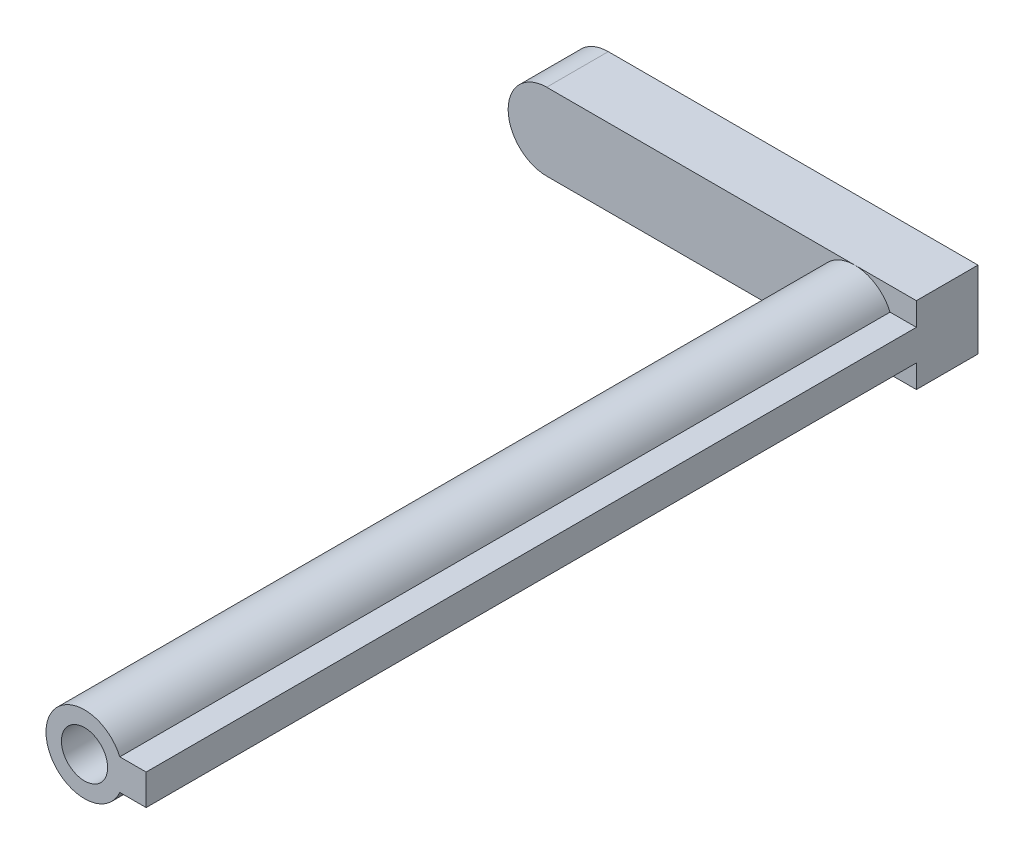
ISO-10303-21;
HEADER;
FILE_DESCRIPTION(('STEP AP214'),'2;1');
FILE_NAME('part.step','',(''),(''),'','','');
FILE_SCHEMA(('AUTOMOTIVE_DESIGN { 1 0 10303 214 1 1 1 1 }'));
ENDSEC;
DATA;
#1=APPLICATION_CONTEXT('core data for automotive mechanical design processes');
#2=APPLICATION_PROTOCOL_DEFINITION('international standard','automotive_design',2000,#1);
#3=PRODUCT_CONTEXT('',#1,'mechanical');
#4=PRODUCT('Part','Part','',(#3));
#5=PRODUCT_RELATED_PRODUCT_CATEGORY('part','',(#4));
#6=PRODUCT_DEFINITION_FORMATION('','',#4);
#7=PRODUCT_DEFINITION_CONTEXT('part definition',#1,'design');
#8=PRODUCT_DEFINITION('design','',#6,#7);
#9=PRODUCT_DEFINITION_SHAPE('','',#8);
#10=(LENGTH_UNIT() NAMED_UNIT(*) SI_UNIT(.MILLI.,.METRE.));
#11=(NAMED_UNIT(*) PLANE_ANGLE_UNIT() SI_UNIT($,.RADIAN.));
#12=(NAMED_UNIT(*) SI_UNIT($,.STERADIAN.) SOLID_ANGLE_UNIT());
#13=UNCERTAINTY_MEASURE_WITH_UNIT(LENGTH_MEASURE(1.E-05),#10,'distance_accuracy_value','');
#14=(GEOMETRIC_REPRESENTATION_CONTEXT(3) GLOBAL_UNCERTAINTY_ASSIGNED_CONTEXT((#13)) GLOBAL_UNIT_ASSIGNED_CONTEXT((#10,
#11,#12)) REPRESENTATION_CONTEXT('',''));
#15=CARTESIAN_POINT('',(0.,0.,0.));
#16=DIRECTION('',(0.,0.,1.));
#17=DIRECTION('',(1.,0.,0.));
#18=AXIS2_PLACEMENT_3D('',#15,#16,#17);
#19=CARTESIAN_POINT('',(0.,0.,5.));
#20=DIRECTION('',(0.,0.,-1.));
#21=DIRECTION('',(-1.,0.,0.));
#22=AXIS2_PLACEMENT_3D('',#19,#20,#21);
#23=CYLINDRICAL_SURFACE('',#22,5.);
#24=DIRECTION('',(0.,0.,-1.));
#25=VECTOR('',#24,1.);
#26=CARTESIAN_POINT('',(4.58257569495584,2.,5.));
#27=LINE('',#26,#25);
#28=CARTESIAN_POINT('',(4.58257569495584,2.,0.));
#29=VERTEX_POINT('',#28);
#30=CARTESIAN_POINT('',(4.58257569495584,2.,-100.));
#31=VERTEX_POINT('',#30);
#32=EDGE_CURVE('E209',#29,#31,#27,.T.);
#33=ORIENTED_EDGE('',*,*,#32,.T.);
#34=CARTESIAN_POINT('',(0.,0.,-100.));
#35=DIRECTION('',(0.,0.,1.));
#36=DIRECTION('',(1.,0.,0.));
#37=AXIS2_PLACEMENT_3D('',#34,#35,#36);
#38=CIRCLE('',#37,5.);
#39=CARTESIAN_POINT('',(0.,4.99999999999999,-100.));
#40=VERTEX_POINT('',#39);
#41=EDGE_CURVE('E227',#31,#40,#38,.T.);
#42=ORIENTED_EDGE('',*,*,#41,.T.);
#43=CARTESIAN_POINT('',(0.,0.,-100.));
#44=DIRECTION('',(0.,0.,1.));
#45=DIRECTION('',(1.,0.,0.));
#46=AXIS2_PLACEMENT_3D('',#43,#44,#45);
#47=CIRCLE('',#46,5.);
#48=CARTESIAN_POINT('',(0.,-5.,-100.));
#49=VERTEX_POINT('',#48);
#50=EDGE_CURVE('E199',#40,#49,#47,.T.);
#51=ORIENTED_EDGE('',*,*,#50,.T.);
#52=CARTESIAN_POINT('',(4.58257569495584,-2.,-100.));
#53=VERTEX_POINT('',#52);
#54=EDGE_CURVE('E146',#49,#53,#38,.T.);
#55=ORIENTED_EDGE('',*,*,#54,.T.);
#56=DIRECTION('',(0.,0.,-1.));
#57=VECTOR('',#56,1.);
#58=CARTESIAN_POINT('',(4.58257569495584,-2.,5.));
#59=LINE('',#58,#57);
#60=CARTESIAN_POINT('',(4.58257569495584,-2.,0.));
#61=VERTEX_POINT('',#60);
#62=EDGE_CURVE('E11',#61,#53,#59,.T.);
#63=ORIENTED_EDGE('',*,*,#62,.F.);
#64=CARTESIAN_POINT('',(0.,0.,0.));
#65=DIRECTION('',(0.,0.,1.));
#66=DIRECTION('',(1.,0.,0.));
#67=AXIS2_PLACEMENT_3D('',#64,#65,#66);
#68=CIRCLE('',#67,5.);
#69=EDGE_CURVE('E197',#29,#61,#68,.T.);
#70=ORIENTED_EDGE('',*,*,#69,.F.);
#71=EDGE_LOOP('',(#33,#42,#51,#55,#63,#70));
#72=FACE_BOUND('',#71,.T.);
#73=ADVANCED_FACE('F41',(#72),#23,.T.);
#74=CARTESIAN_POINT('',(8.,-2.,5.));
#75=DIRECTION('',(0.,1.,0.));
#76=DIRECTION('',(0.,0.,1.));
#77=AXIS2_PLACEMENT_3D('',#74,#75,#76);
#78=PLANE('',#77);
#79=DIRECTION('',(1.,0.,0.));
#80=VECTOR('',#79,1.);
#81=CARTESIAN_POINT('',(8.,-2.,0.));
#82=LINE('',#81,#80);
#83=CARTESIAN_POINT('',(8.,-2.,0.));
#84=VERTEX_POINT('',#83);
#85=EDGE_CURVE('E195',#61,#84,#82,.T.);
#86=ORIENTED_EDGE('',*,*,#85,.F.);
#87=ORIENTED_EDGE('',*,*,#62,.T.);
#88=DIRECTION('',(1.,0.,0.));
#89=VECTOR('',#88,1.);
#90=CARTESIAN_POINT('',(8.,-2.,-100.));
#91=LINE('',#90,#89);
#92=CARTESIAN_POINT('',(8.,-2.,-100.));
#93=VERTEX_POINT('',#92);
#94=EDGE_CURVE('E204',#53,#93,#91,.T.);
#95=ORIENTED_EDGE('',*,*,#94,.T.);
#96=DIRECTION('',(0.,0.,-1.));
#97=VECTOR('',#96,1.);
#98=CARTESIAN_POINT('',(8.,-2.,5.));
#99=LINE('',#98,#97);
#100=EDGE_CURVE('E49',#84,#93,#99,.T.);
#101=ORIENTED_EDGE('',*,*,#100,.F.);
#102=EDGE_LOOP('',(#86,#87,#95,#101));
#103=FACE_BOUND('',#102,.T.);
#104=ADVANCED_FACE('F216',(#103),#78,.F.);
#105=CARTESIAN_POINT('',(8.,2.,5.));
#106=DIRECTION('',(-1.,0.,0.));
#107=DIRECTION('',(0.,0.,1.));
#108=AXIS2_PLACEMENT_3D('',#105,#106,#107);
#109=PLANE('',#108);
#110=DIRECTION('',(0.,1.,0.));
#111=VECTOR('',#110,1.);
#112=CARTESIAN_POINT('',(8.,2.,0.));
#113=LINE('',#112,#111);
#114=CARTESIAN_POINT('',(8.,2.,0.));
#115=VERTEX_POINT('',#114);
#116=EDGE_CURVE('E56',#84,#115,#113,.T.);
#117=ORIENTED_EDGE('',*,*,#116,.F.);
#118=ORIENTED_EDGE('',*,*,#100,.T.);
#119=DIRECTION('',(0.,-1.,0.));
#120=VECTOR('',#119,1.);
#121=CARTESIAN_POINT('',(8.,4.99999999999999,-100.));
#122=LINE('',#121,#120);
#123=CARTESIAN_POINT('',(8.,-5.,-100.));
#124=VERTEX_POINT('',#123);
#125=EDGE_CURVE('E133',#93,#124,#122,.T.);
#126=ORIENTED_EDGE('',*,*,#125,.T.);
#127=DIRECTION('',(0.,0.,1.));
#128=VECTOR('',#127,1.);
#129=CARTESIAN_POINT('',(8.,-5.,-120.806248474866));
#130=LINE('',#129,#128);
#131=CARTESIAN_POINT('',(8.,-5.,-108.));
#132=VERTEX_POINT('',#131);
#133=EDGE_CURVE('E117',#132,#124,#130,.T.);
#134=ORIENTED_EDGE('',*,*,#133,.F.);
#135=DIRECTION('',(0.,-1.,0.));
#136=VECTOR('',#135,1.);
#137=CARTESIAN_POINT('',(8.,4.99999999999999,-108.));
#138=LINE('',#137,#136);
#139=CARTESIAN_POINT('',(8.,4.99999999999999,-108.));
#140=VERTEX_POINT('',#139);
#141=EDGE_CURVE('E130',#140,#132,#138,.T.);
#142=ORIENTED_EDGE('',*,*,#141,.F.);
#143=DIRECTION('',(0.,0.,1.));
#144=VECTOR('',#143,1.);
#145=CARTESIAN_POINT('',(8.,4.99999999999999,-120.806248474866));
#146=LINE('',#145,#144);
#147=CARTESIAN_POINT('',(8.,4.99999999999999,-100.));
#148=VERTEX_POINT('',#147);
#149=EDGE_CURVE('E148',#140,#148,#146,.T.);
#150=ORIENTED_EDGE('',*,*,#149,.T.);
#151=CARTESIAN_POINT('',(8.,2.,-100.));
#152=VERTEX_POINT('',#151);
#153=EDGE_CURVE('E135',#148,#152,#122,.T.);
#154=ORIENTED_EDGE('',*,*,#153,.T.);
#155=DIRECTION('',(0.,0.,-1.));
#156=VECTOR('',#155,1.);
#157=CARTESIAN_POINT('',(8.,2.,5.));
#158=LINE('',#157,#156);
#159=EDGE_CURVE('E63',#115,#152,#158,.T.);
#160=ORIENTED_EDGE('',*,*,#159,.F.);
#161=EDGE_LOOP('',(#117,#118,#126,#134,#142,#150,#154,#160));
#162=FACE_BOUND('',#161,.T.);
#163=ADVANCED_FACE('F129',(#162),#109,.F.);
#164=CARTESIAN_POINT('',(4.58257569495584,2.,5.));
#165=DIRECTION('',(0.,-1.,0.));
#166=DIRECTION('',(0.,0.,-1.));
#167=AXIS2_PLACEMENT_3D('',#164,#165,#166);
#168=PLANE('',#167);
#169=DIRECTION('',(-1.,0.,0.));
#170=VECTOR('',#169,1.);
#171=CARTESIAN_POINT('',(4.58257569495584,2.,0.));
#172=LINE('',#171,#170);
#173=EDGE_CURVE('E192',#115,#29,#172,.T.);
#174=ORIENTED_EDGE('',*,*,#173,.F.);
#175=ORIENTED_EDGE('',*,*,#159,.T.);
#176=DIRECTION('',(-1.,0.,0.));
#177=VECTOR('',#176,1.);
#178=CARTESIAN_POINT('',(4.58257569495584,2.,-100.));
#179=LINE('',#178,#177);
#180=EDGE_CURVE('E207',#152,#31,#179,.T.);
#181=ORIENTED_EDGE('',*,*,#180,.T.);
#182=ORIENTED_EDGE('',*,*,#32,.F.);
#183=EDGE_LOOP('',(#174,#175,#181,#182));
#184=FACE_BOUND('',#183,.T.);
#185=ADVANCED_FACE('F269',(#184),#168,.F.);
#186=CARTESIAN_POINT('',(0.,0.,5.));
#187=DIRECTION('',(0.,0.,-1.));
#188=DIRECTION('',(-1.,0.,0.));
#189=AXIS2_PLACEMENT_3D('',#186,#187,#188);
#190=CYLINDRICAL_SURFACE('',#189,3.);
#191=CARTESIAN_POINT('',(0.,0.,-100.));
#192=DIRECTION('',(0.,0.,-1.));
#193=DIRECTION('',(-1.,0.,0.));
#194=AXIS2_PLACEMENT_3D('',#191,#192,#193);
#195=CIRCLE('',#194,3.);
#196=CARTESIAN_POINT('',(-3.,0.,-100.));
#197=VERTEX_POINT('',#196);
#198=EDGE_CURVE('E191',#197,#197,#195,.T.);
#199=ORIENTED_EDGE('',*,*,#198,.T.);
#200=EDGE_LOOP('',(#199));
#201=FACE_BOUND('',#200,.T.);
#202=CARTESIAN_POINT('',(0.,0.,0.));
#203=DIRECTION('',(0.,0.,1.));
#204=DIRECTION('',(1.,0.,0.));
#205=AXIS2_PLACEMENT_3D('',#202,#203,#204);
#206=CIRCLE('',#205,3.);
#207=CARTESIAN_POINT('',(3.,0.,0.));
#208=VERTEX_POINT('',#207);
#209=EDGE_CURVE('E44',#208,#208,#206,.F.);
#210=ORIENTED_EDGE('',*,*,#209,.F.);
#211=EDGE_LOOP('',(#210));
#212=FACE_BOUND('',#211,.T.);
#213=ADVANCED_FACE('F254',(#201,#212),#190,.F.);
#214=CARTESIAN_POINT('',(0.,0.,0.));
#215=DIRECTION('',(0.,0.,1.));
#216=DIRECTION('',(1.,0.,0.));
#217=AXIS2_PLACEMENT_3D('',#214,#215,#216);
#218=PLANE('',#217);
#219=ORIENTED_EDGE('',*,*,#209,.T.);
#220=EDGE_LOOP('',(#219));
#221=FACE_BOUND('',#220,.T.);
#222=ORIENTED_EDGE('',*,*,#69,.T.);
#223=ORIENTED_EDGE('',*,*,#85,.T.);
#224=ORIENTED_EDGE('',*,*,#116,.T.);
#225=ORIENTED_EDGE('',*,*,#173,.T.);
#226=EDGE_LOOP('',(#222,#223,#224,#225));
#227=FACE_BOUND('',#226,.T.);
#228=ADVANCED_FACE('F244',(#221,#227),#218,.T.);
#229=CARTESIAN_POINT('',(-40.,0.,-100.));
#230=DIRECTION('',(0.,0.,-1.));
#231=DIRECTION('',(-1.,0.,0.));
#232=AXIS2_PLACEMENT_3D('',#229,#230,#231);
#233=PLANE('',#232);
#234=ORIENTED_EDGE('',*,*,#50,.F.);
#235=DIRECTION('',(1.,0.,0.));
#236=VECTOR('',#235,1.);
#237=CARTESIAN_POINT('',(-40.,4.99999999999999,-100.));
#238=LINE('',#237,#236);
#239=CARTESIAN_POINT('',(-40.,4.99999999999999,-100.));
#240=VERTEX_POINT('',#239);
#241=EDGE_CURVE('E184',#240,#40,#238,.T.);
#242=ORIENTED_EDGE('',*,*,#241,.F.);
#243=CARTESIAN_POINT('',(-40.,0.,-100.));
#244=DIRECTION('',(0.,0.,-1.));
#245=DIRECTION('',(-1.,0.,0.));
#246=AXIS2_PLACEMENT_3D('',#243,#244,#245);
#247=CIRCLE('',#246,4.99999999999999);
#248=CARTESIAN_POINT('',(-40.,-4.99999999999999,-100.));
#249=VERTEX_POINT('',#248);
#250=EDGE_CURVE('E154',#249,#240,#247,.T.);
#251=ORIENTED_EDGE('',*,*,#250,.F.);
#252=DIRECTION('',(-1.,0.,0.));
#253=VECTOR('',#252,1.);
#254=CARTESIAN_POINT('',(-40.,-4.99999999999999,-100.));
#255=LINE('',#254,#253);
#256=EDGE_CURVE('E180',#49,#249,#255,.T.);
#257=ORIENTED_EDGE('',*,*,#256,.F.);
#258=EDGE_LOOP('',(#234,#242,#251,#257));
#259=FACE_BOUND('',#258,.T.);
#260=ADVANCED_FACE('F242',(#259),#233,.F.);
#261=CARTESIAN_POINT('',(-40.,0.,-108.));
#262=DIRECTION('',(0.,0.,-1.));
#263=DIRECTION('',(-1.,0.,0.));
#264=AXIS2_PLACEMENT_3D('',#261,#262,#263);
#265=PLANE('',#264);
#266=CARTESIAN_POINT('',(0.,0.,-108.));
#267=DIRECTION('',(0.,0.,-1.));
#268=DIRECTION('',(-1.,0.,0.));
#269=AXIS2_PLACEMENT_3D('',#266,#267,#268);
#270=CIRCLE('',#269,3.225);
#271=CARTESIAN_POINT('',(-3.225,0.,-108.));
#272=VERTEX_POINT('',#271);
#273=EDGE_CURVE('E155',#272,#272,#270,.T.);
#274=ORIENTED_EDGE('',*,*,#273,.F.);
#275=EDGE_LOOP('',(#274));
#276=FACE_BOUND('',#275,.T.);
#277=CARTESIAN_POINT('',(-30.,0.,-108.));
#278=DIRECTION('',(0.,0.,-1.));
#279=DIRECTION('',(-1.,0.,0.));
#280=AXIS2_PLACEMENT_3D('',#277,#278,#279);
#281=CIRCLE('',#280,3.225);
#282=CARTESIAN_POINT('',(-33.225,0.,-108.));
#283=VERTEX_POINT('',#282);
#284=EDGE_CURVE('E141',#283,#283,#281,.T.);
#285=ORIENTED_EDGE('',*,*,#284,.F.);
#286=EDGE_LOOP('',(#285));
#287=FACE_BOUND('',#286,.T.);
#288=CARTESIAN_POINT('',(-10.,0.,-108.));
#289=DIRECTION('',(0.,0.,-1.));
#290=DIRECTION('',(-1.,0.,0.));
#291=AXIS2_PLACEMENT_3D('',#288,#289,#290);
#292=CIRCLE('',#291,3.225);
#293=CARTESIAN_POINT('',(-13.225,0.,-108.));
#294=VERTEX_POINT('',#293);
#295=EDGE_CURVE('E159',#294,#294,#292,.T.);
#296=ORIENTED_EDGE('',*,*,#295,.F.);
#297=EDGE_LOOP('',(#296));
#298=FACE_BOUND('',#297,.T.);
#299=CARTESIAN_POINT('',(-20.,0.,-108.));
#300=DIRECTION('',(0.,0.,-1.));
#301=DIRECTION('',(-1.,0.,0.));
#302=AXIS2_PLACEMENT_3D('',#299,#300,#301);
#303=CIRCLE('',#302,3.225);
#304=CARTESIAN_POINT('',(-23.225,0.,-108.));
#305=VERTEX_POINT('',#304);
#306=EDGE_CURVE('E173',#305,#305,#303,.T.);
#307=ORIENTED_EDGE('',*,*,#306,.F.);
#308=EDGE_LOOP('',(#307));
#309=FACE_BOUND('',#308,.T.);
#310=CARTESIAN_POINT('',(-40.,0.,-108.));
#311=DIRECTION('',(0.,0.,-1.));
#312=DIRECTION('',(-1.,0.,0.));
#313=AXIS2_PLACEMENT_3D('',#310,#311,#312);
#314=CIRCLE('',#313,3.225);
#315=CARTESIAN_POINT('',(-43.225,0.,-108.));
#316=VERTEX_POINT('',#315);
#317=EDGE_CURVE('E158',#316,#316,#314,.T.);
#318=ORIENTED_EDGE('',*,*,#317,.F.);
#319=EDGE_LOOP('',(#318));
#320=FACE_BOUND('',#319,.T.);
#321=CARTESIAN_POINT('',(-40.,0.,-108.));
#322=DIRECTION('',(0.,0.,-1.));
#323=DIRECTION('',(-1.,0.,0.));
#324=AXIS2_PLACEMENT_3D('',#321,#322,#323);
#325=CIRCLE('',#324,4.99999999999999);
#326=CARTESIAN_POINT('',(-40.,-4.99999999999999,-108.));
#327=VERTEX_POINT('',#326);
#328=CARTESIAN_POINT('',(-40.,4.99999999999999,-108.));
#329=VERTEX_POINT('',#328);
#330=EDGE_CURVE('E178',#327,#329,#325,.T.);
#331=ORIENTED_EDGE('',*,*,#330,.T.);
#332=DIRECTION('',(1.,0.,0.));
#333=VECTOR('',#332,1.);
#334=CARTESIAN_POINT('',(-40.,4.99999999999999,-108.));
#335=LINE('',#334,#333);
#336=EDGE_CURVE('E125',#329,#140,#335,.T.);
#337=ORIENTED_EDGE('',*,*,#336,.T.);
#338=ORIENTED_EDGE('',*,*,#141,.T.);
#339=DIRECTION('',(-1.,0.,0.));
#340=VECTOR('',#339,1.);
#341=CARTESIAN_POINT('',(-40.,-4.99999999999999,-108.));
#342=LINE('',#341,#340);
#343=EDGE_CURVE('E113',#132,#327,#342,.T.);
#344=ORIENTED_EDGE('',*,*,#343,.T.);
#345=EDGE_LOOP('',(#331,#337,#338,#344));
#346=FACE_BOUND('',#345,.T.);
#347=ADVANCED_FACE('F137',(#276,#287,#298,#309,#320,#346),#265,.T.);
#348=CARTESIAN_POINT('',(-40.,-4.99999999999999,-108.));
#349=DIRECTION('',(0.,1.,0.));
#350=DIRECTION('',(-1.,0.,0.));
#351=AXIS2_PLACEMENT_3D('',#348,#349,#350);
#352=PLANE('',#351);
#353=ORIENTED_EDGE('',*,*,#256,.T.);
#354=DIRECTION('',(0.,0.,1.));
#355=VECTOR('',#354,1.);
#356=CARTESIAN_POINT('',(-40.,-4.99999999999999,-108.));
#357=LINE('',#356,#355);
#358=EDGE_CURVE('E120',#327,#249,#357,.T.);
#359=ORIENTED_EDGE('',*,*,#358,.F.);
#360=ORIENTED_EDGE('',*,*,#343,.F.);
#361=ORIENTED_EDGE('',*,*,#133,.T.);
#362=DIRECTION('',(-1.,0.,0.));
#363=VECTOR('',#362,1.);
#364=CARTESIAN_POINT('',(8.,-5.,-100.));
#365=LINE('',#364,#363);
#366=EDGE_CURVE('E134',#124,#49,#365,.T.);
#367=ORIENTED_EDGE('',*,*,#366,.T.);
#368=EDGE_LOOP('',(#353,#359,#360,#361,#367));
#369=FACE_BOUND('',#368,.T.);
#370=ADVANCED_FACE('F115',(#369),#352,.F.);
#371=CARTESIAN_POINT('',(-40.,4.99999999999999,-108.));
#372=DIRECTION('',(0.,-1.,0.));
#373=DIRECTION('',(1.,0.,0.));
#374=AXIS2_PLACEMENT_3D('',#371,#372,#373);
#375=PLANE('',#374);
#376=ORIENTED_EDGE('',*,*,#241,.T.);
#377=DIRECTION('',(1.,0.,0.));
#378=VECTOR('',#377,1.);
#379=CARTESIAN_POINT('',(0.,4.99999999999999,-100.));
#380=LINE('',#379,#378);
#381=EDGE_CURVE('E149',#40,#148,#380,.T.);
#382=ORIENTED_EDGE('',*,*,#381,.T.);
#383=ORIENTED_EDGE('',*,*,#149,.F.);
#384=ORIENTED_EDGE('',*,*,#336,.F.);
#385=DIRECTION('',(0.,0.,1.));
#386=VECTOR('',#385,1.);
#387=CARTESIAN_POINT('',(-40.,4.99999999999999,-108.));
#388=LINE('',#387,#386);
#389=EDGE_CURVE('E188',#329,#240,#388,.T.);
#390=ORIENTED_EDGE('',*,*,#389,.T.);
#391=EDGE_LOOP('',(#376,#382,#383,#384,#390));
#392=FACE_BOUND('',#391,.T.);
#393=ADVANCED_FACE('F236',(#392),#375,.F.);
#394=CARTESIAN_POINT('',(-40.,0.,-108.));
#395=DIRECTION('',(0.,0.,1.));
#396=DIRECTION('',(1.,0.,0.));
#397=AXIS2_PLACEMENT_3D('',#394,#395,#396);
#398=CYLINDRICAL_SURFACE('',#397,4.99999999999999);
#399=ORIENTED_EDGE('',*,*,#250,.T.);
#400=ORIENTED_EDGE('',*,*,#389,.F.);
#401=ORIENTED_EDGE('',*,*,#330,.F.);
#402=ORIENTED_EDGE('',*,*,#358,.T.);
#403=EDGE_LOOP('',(#399,#400,#401,#402));
#404=FACE_BOUND('',#403,.T.);
#405=ADVANCED_FACE('F239',(#404),#398,.T.);
#406=ORIENTED_EDGE('',*,*,#198,.F.);
#407=EDGE_LOOP('',(#406));
#408=FACE_BOUND('',#407,.T.);
#409=ADVANCED_FACE('F246',(#408),#233,.F.);
#410=CARTESIAN_POINT('',(-40.,0.,-104.95));
#411=DIRECTION('',(0.,0.,-1.));
#412=DIRECTION('',(-1.,0.,0.));
#413=AXIS2_PLACEMENT_3D('',#410,#411,#412);
#414=CYLINDRICAL_SURFACE('',#413,3.225);
#415=CARTESIAN_POINT('',(-40.,0.,-104.95));
#416=DIRECTION('',(0.,0.,-1.));
#417=DIRECTION('',(-1.,0.,0.));
#418=AXIS2_PLACEMENT_3D('',#415,#416,#417);
#419=CIRCLE('',#418,3.225);
#420=CARTESIAN_POINT('',(-43.225,0.,-104.95));
#421=VERTEX_POINT('',#420);
#422=EDGE_CURVE('E170',#421,#421,#419,.T.);
#423=ORIENTED_EDGE('',*,*,#422,.F.);
#424=EDGE_LOOP('',(#423));
#425=FACE_BOUND('',#424,.T.);
#426=ORIENTED_EDGE('',*,*,#317,.T.);
#427=EDGE_LOOP('',(#426));
#428=FACE_BOUND('',#427,.T.);
#429=ADVANCED_FACE('F259',(#425,#428),#414,.F.);
#430=CARTESIAN_POINT('',(-40.,0.,-104.95));
#431=DIRECTION('',(0.,0.,-1.));
#432=DIRECTION('',(-1.,0.,0.));
#433=AXIS2_PLACEMENT_3D('',#430,#431,#432);
#434=PLANE('',#433);
#435=ORIENTED_EDGE('',*,*,#422,.T.);
#436=EDGE_LOOP('',(#435));
#437=FACE_BOUND('',#436,.T.);
#438=ADVANCED_FACE('F376',(#437),#434,.T.);
#439=CARTESIAN_POINT('',(-20.,0.,-104.95));
#440=DIRECTION('',(0.,0.,-1.));
#441=DIRECTION('',(-1.,0.,0.));
#442=AXIS2_PLACEMENT_3D('',#439,#440,#441);
#443=CYLINDRICAL_SURFACE('',#442,3.225);
#444=CARTESIAN_POINT('',(-20.,0.,-104.95));
#445=DIRECTION('',(0.,0.,-1.));
#446=DIRECTION('',(-1.,0.,0.));
#447=AXIS2_PLACEMENT_3D('',#444,#445,#446);
#448=CIRCLE('',#447,3.225);
#449=CARTESIAN_POINT('',(-23.225,0.,-104.95));
#450=VERTEX_POINT('',#449);
#451=EDGE_CURVE('E162',#450,#450,#448,.T.);
#452=ORIENTED_EDGE('',*,*,#451,.F.);
#453=EDGE_LOOP('',(#452));
#454=FACE_BOUND('',#453,.T.);
#455=ORIENTED_EDGE('',*,*,#306,.T.);
#456=EDGE_LOOP('',(#455));
#457=FACE_BOUND('',#456,.T.);
#458=ADVANCED_FACE('F367',(#454,#457),#443,.F.);
#459=CARTESIAN_POINT('',(-20.,0.,-104.95));
#460=DIRECTION('',(0.,0.,-1.));
#461=DIRECTION('',(-1.,0.,0.));
#462=AXIS2_PLACEMENT_3D('',#459,#460,#461);
#463=PLANE('',#462);
#464=ORIENTED_EDGE('',*,*,#451,.T.);
#465=EDGE_LOOP('',(#464));
#466=FACE_BOUND('',#465,.T.);
#467=ADVANCED_FACE('F358',(#466),#463,.T.);
#468=CARTESIAN_POINT('',(-10.,0.,-104.95));
#469=DIRECTION('',(0.,0.,-1.));
#470=DIRECTION('',(-1.,0.,0.));
#471=AXIS2_PLACEMENT_3D('',#468,#469,#470);
#472=CYLINDRICAL_SURFACE('',#471,3.225);
#473=CARTESIAN_POINT('',(-10.,0.,-104.95));
#474=DIRECTION('',(0.,0.,-1.));
#475=DIRECTION('',(-1.,0.,0.));
#476=AXIS2_PLACEMENT_3D('',#473,#474,#475);
#477=CIRCLE('',#476,3.225);
#478=CARTESIAN_POINT('',(-13.225,0.,-104.95));
#479=VERTEX_POINT('',#478);
#480=EDGE_CURVE('E163',#479,#479,#477,.T.);
#481=ORIENTED_EDGE('',*,*,#480,.F.);
#482=EDGE_LOOP('',(#481));
#483=FACE_BOUND('',#482,.T.);
#484=ORIENTED_EDGE('',*,*,#295,.T.);
#485=EDGE_LOOP('',(#484));
#486=FACE_BOUND('',#485,.T.);
#487=ADVANCED_FACE('F349',(#483,#486),#472,.F.);
#488=CARTESIAN_POINT('',(-10.,0.,-104.95));
#489=DIRECTION('',(0.,0.,-1.));
#490=DIRECTION('',(-1.,0.,0.));
#491=AXIS2_PLACEMENT_3D('',#488,#489,#490);
#492=PLANE('',#491);
#493=ORIENTED_EDGE('',*,*,#480,.T.);
#494=EDGE_LOOP('',(#493));
#495=FACE_BOUND('',#494,.T.);
#496=ADVANCED_FACE('F340',(#495),#492,.T.);
#497=CARTESIAN_POINT('',(-30.,0.,-104.95));
#498=DIRECTION('',(0.,0.,-1.));
#499=DIRECTION('',(-1.,0.,0.));
#500=AXIS2_PLACEMENT_3D('',#497,#498,#499);
#501=CYLINDRICAL_SURFACE('',#500,3.225);
#502=CARTESIAN_POINT('',(-30.,0.,-104.95));
#503=DIRECTION('',(0.,0.,-1.));
#504=DIRECTION('',(-1.,0.,0.));
#505=AXIS2_PLACEMENT_3D('',#502,#503,#504);
#506=CIRCLE('',#505,3.225);
#507=CARTESIAN_POINT('',(-33.225,0.,-104.95));
#508=VERTEX_POINT('',#507);
#509=EDGE_CURVE('E138',#508,#508,#506,.T.);
#510=ORIENTED_EDGE('',*,*,#509,.F.);
#511=EDGE_LOOP('',(#510));
#512=FACE_BOUND('',#511,.T.);
#513=ORIENTED_EDGE('',*,*,#284,.T.);
#514=EDGE_LOOP('',(#513));
#515=FACE_BOUND('',#514,.T.);
#516=ADVANCED_FACE('F331',(#512,#515),#501,.F.);
#517=CARTESIAN_POINT('',(-30.,0.,-104.95));
#518=DIRECTION('',(0.,0.,-1.));
#519=DIRECTION('',(-1.,0.,0.));
#520=AXIS2_PLACEMENT_3D('',#517,#518,#519);
#521=PLANE('',#520);
#522=ORIENTED_EDGE('',*,*,#509,.T.);
#523=EDGE_LOOP('',(#522));
#524=FACE_BOUND('',#523,.T.);
#525=ADVANCED_FACE('F322',(#524),#521,.T.);
#526=CARTESIAN_POINT('',(0.,0.,-104.95));
#527=DIRECTION('',(0.,0.,-1.));
#528=DIRECTION('',(-1.,0.,0.));
#529=AXIS2_PLACEMENT_3D('',#526,#527,#528);
#530=CYLINDRICAL_SURFACE('',#529,3.225);
#531=CARTESIAN_POINT('',(0.,0.,-104.95));
#532=DIRECTION('',(0.,0.,-1.));
#533=DIRECTION('',(-1.,0.,0.));
#534=AXIS2_PLACEMENT_3D('',#531,#532,#533);
#535=CIRCLE('',#534,3.225);
#536=CARTESIAN_POINT('',(-3.225,0.,-104.95));
#537=VERTEX_POINT('',#536);
#538=EDGE_CURVE('E151',#537,#537,#535,.T.);
#539=ORIENTED_EDGE('',*,*,#538,.F.);
#540=EDGE_LOOP('',(#539));
#541=FACE_BOUND('',#540,.T.);
#542=ORIENTED_EDGE('',*,*,#273,.T.);
#543=EDGE_LOOP('',(#542));
#544=FACE_BOUND('',#543,.T.);
#545=ADVANCED_FACE('F312',(#541,#544),#530,.F.);
#546=CARTESIAN_POINT('',(0.,0.,-104.95));
#547=DIRECTION('',(0.,0.,-1.));
#548=DIRECTION('',(-1.,0.,0.));
#549=AXIS2_PLACEMENT_3D('',#546,#547,#548);
#550=PLANE('',#549);
#551=ORIENTED_EDGE('',*,*,#538,.T.);
#552=EDGE_LOOP('',(#551));
#553=FACE_BOUND('',#552,.T.);
#554=ADVANCED_FACE('F296',(#553),#550,.T.);
#555=CARTESIAN_POINT('',(0.,0.,-100.));
#556=DIRECTION('',(0.,0.,1.));
#557=DIRECTION('',(1.,0.,0.));
#558=AXIS2_PLACEMENT_3D('',#555,#556,#557);
#559=PLANE('',#558);
#560=ORIENTED_EDGE('',*,*,#94,.F.);
#561=ORIENTED_EDGE('',*,*,#54,.F.);
#562=ORIENTED_EDGE('',*,*,#366,.F.);
#563=ORIENTED_EDGE('',*,*,#125,.F.);
#564=EDGE_LOOP('',(#560,#561,#562,#563));
#565=FACE_BOUND('',#564,.T.);
#566=ADVANCED_FACE('F220',(#565),#559,.T.);
#567=ORIENTED_EDGE('',*,*,#180,.F.);
#568=ORIENTED_EDGE('',*,*,#153,.F.);
#569=ORIENTED_EDGE('',*,*,#381,.F.);
#570=ORIENTED_EDGE('',*,*,#41,.F.);
#571=EDGE_LOOP('',(#567,#568,#569,#570));
#572=FACE_BOUND('',#571,.T.);
#573=ADVANCED_FACE('F235',(#572),#559,.T.);
#574=CLOSED_SHELL('',(#73,#104,#163,#185,#213,#228,#260,#347,#370,#393,#405,#409,#429,#438,#458,
#467,#487,#496,#516,#525,#545,#554,#566,#573));
#575=MANIFOLD_SOLID_BREP('B2',#574);
#576=ADVANCED_BREP_SHAPE_REPRESENTATION('',(#18,#575),#14);
#577=SHAPE_DEFINITION_REPRESENTATION(#9,#576);
ENDSEC;
END-ISO-10303-21;
